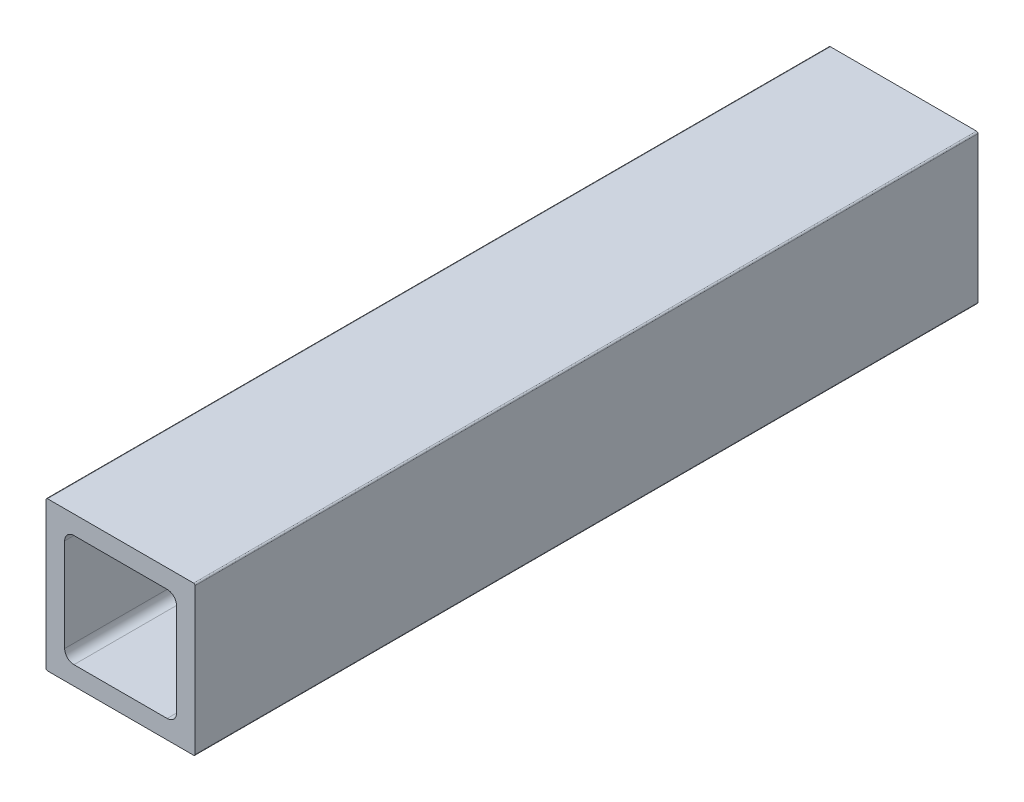
ISO-10303-21;
HEADER;
FILE_DESCRIPTION(('STEP AP214'),'2;1');
FILE_NAME('part.step','',(''),(''),'','','');
FILE_SCHEMA(('AUTOMOTIVE_DESIGN { 1 0 10303 214 1 1 1 1 }'));
ENDSEC;
DATA;
#1=APPLICATION_CONTEXT('core data for automotive mechanical design processes');
#2=APPLICATION_PROTOCOL_DEFINITION('international standard','automotive_design',2000,#1);
#3=PRODUCT_CONTEXT('',#1,'mechanical');
#4=PRODUCT('Part','Part','',(#3));
#5=PRODUCT_RELATED_PRODUCT_CATEGORY('part','',(#4));
#6=PRODUCT_DEFINITION_FORMATION('','',#4);
#7=PRODUCT_DEFINITION_CONTEXT('part definition',#1,'design');
#8=PRODUCT_DEFINITION('design','',#6,#7);
#9=PRODUCT_DEFINITION_SHAPE('','',#8);
#10=(LENGTH_UNIT() NAMED_UNIT(*) SI_UNIT(.MILLI.,.METRE.));
#11=(NAMED_UNIT(*) PLANE_ANGLE_UNIT() SI_UNIT($,.RADIAN.));
#12=(NAMED_UNIT(*) SI_UNIT($,.STERADIAN.) SOLID_ANGLE_UNIT());
#13=UNCERTAINTY_MEASURE_WITH_UNIT(LENGTH_MEASURE(1.E-05),#10,'distance_accuracy_value','');
#14=(GEOMETRIC_REPRESENTATION_CONTEXT(3) GLOBAL_UNCERTAINTY_ASSIGNED_CONTEXT((#13)) GLOBAL_UNIT_ASSIGNED_CONTEXT((#10,
#11,#12)) REPRESENTATION_CONTEXT('',''));
#15=CARTESIAN_POINT('',(0.,0.,0.));
#16=DIRECTION('',(0.,0.,1.));
#17=DIRECTION('',(1.,0.,0.));
#18=AXIS2_PLACEMENT_3D('',#15,#16,#17);
#19=CARTESIAN_POINT('',(0.254,0.254,0.));
#20=DIRECTION('',(0.,0.,-1.));
#21=DIRECTION('',(0.,-1.,0.));
#22=AXIS2_PLACEMENT_3D('',#19,#20,#21);
#23=PLANE('',#22);
#24=CARTESIAN_POINT('',(0.254,0.254,0.));
#25=DIRECTION('',(0.,0.,1.));
#26=DIRECTION('',(-1.,0.,0.));
#27=AXIS2_PLACEMENT_3D('',#24,#25,#26);
#28=CIRCLE('',#27,0.254);
#29=CARTESIAN_POINT('',(0.,0.254,0.));
#30=VERTEX_POINT('',#29);
#31=CARTESIAN_POINT('',(0.254,0.,0.));
#32=VERTEX_POINT('',#31);
#33=EDGE_CURVE('E193',#30,#32,#28,.T.);
#34=ORIENTED_EDGE('',*,*,#33,.F.);
#35=DIRECTION('',(0.,-1.,0.));
#36=VECTOR('',#35,1.);
#37=CARTESIAN_POINT('',(0.,0.254,0.));
#38=LINE('',#37,#36);
#39=CARTESIAN_POINT('',(0.,25.146,0.));
#40=VERTEX_POINT('',#39);
#41=EDGE_CURVE('E191',#40,#30,#38,.T.);
#42=ORIENTED_EDGE('',*,*,#41,.F.);
#43=CARTESIAN_POINT('',(0.254,25.146,0.));
#44=DIRECTION('',(0.,0.,1.));
#45=DIRECTION('',(-1.,0.,0.));
#46=AXIS2_PLACEMENT_3D('',#43,#44,#45);
#47=CIRCLE('',#46,0.254);
#48=CARTESIAN_POINT('',(0.254,25.4,0.));
#49=VERTEX_POINT('',#48);
#50=EDGE_CURVE('E213',#49,#40,#47,.T.);
#51=ORIENTED_EDGE('',*,*,#50,.F.);
#52=DIRECTION('',(-1.,0.,0.));
#53=VECTOR('',#52,1.);
#54=CARTESIAN_POINT('',(0.254,25.4,0.));
#55=LINE('',#54,#53);
#56=CARTESIAN_POINT('',(25.146,25.4,0.));
#57=VERTEX_POINT('',#56);
#58=EDGE_CURVE('E204',#57,#49,#55,.T.);
#59=ORIENTED_EDGE('',*,*,#58,.F.);
#60=CARTESIAN_POINT('',(25.146,25.146,0.));
#61=DIRECTION('',(0.,0.,1.));
#62=DIRECTION('',(-1.,0.,0.));
#63=AXIS2_PLACEMENT_3D('',#60,#61,#62);
#64=CIRCLE('',#63,0.254);
#65=CARTESIAN_POINT('',(25.4,25.146,0.));
#66=VERTEX_POINT('',#65);
#67=EDGE_CURVE('E236',#66,#57,#64,.T.);
#68=ORIENTED_EDGE('',*,*,#67,.F.);
#69=DIRECTION('',(0.,1.,0.));
#70=VECTOR('',#69,1.);
#71=CARTESIAN_POINT('',(25.4,0.254,0.));
#72=LINE('',#71,#70);
#73=CARTESIAN_POINT('',(25.4,0.254,0.));
#74=VERTEX_POINT('',#73);
#75=EDGE_CURVE('E235',#74,#66,#72,.T.);
#76=ORIENTED_EDGE('',*,*,#75,.F.);
#77=CARTESIAN_POINT('',(25.146,0.254,0.));
#78=DIRECTION('',(0.,0.,1.));
#79=DIRECTION('',(1.,0.,0.));
#80=AXIS2_PLACEMENT_3D('',#77,#78,#79);
#81=CIRCLE('',#80,0.254);
#82=CARTESIAN_POINT('',(25.146,0.,0.));
#83=VERTEX_POINT('',#82);
#84=EDGE_CURVE('E206',#83,#74,#81,.T.);
#85=ORIENTED_EDGE('',*,*,#84,.F.);
#86=DIRECTION('',(1.,0.,0.));
#87=VECTOR('',#86,1.);
#88=CARTESIAN_POINT('',(0.254,0.,0.));
#89=LINE('',#88,#87);
#90=EDGE_CURVE('E194',#32,#83,#89,.T.);
#91=ORIENTED_EDGE('',*,*,#90,.F.);
#92=EDGE_LOOP('',(#34,#42,#51,#59,#68,#76,#85,#91));
#93=FACE_BOUND('',#92,.T.);
#94=DIRECTION('',(0.,-1.,0.));
#95=VECTOR('',#94,1.);
#96=CARTESIAN_POINT('',(3.175,4.7625,0.));
#97=LINE('',#96,#95);
#98=CARTESIAN_POINT('',(3.175,20.6375,0.));
#99=VERTEX_POINT('',#98);
#100=CARTESIAN_POINT('',(3.175,4.7625,0.));
#101=VERTEX_POINT('',#100);
#102=EDGE_CURVE('E52',#99,#101,#97,.T.);
#103=ORIENTED_EDGE('',*,*,#102,.T.);
#104=CARTESIAN_POINT('',(4.7625,4.7625,0.));
#105=DIRECTION('',(0.,0.,1.));
#106=DIRECTION('',(1.,0.,0.));
#107=AXIS2_PLACEMENT_3D('',#104,#105,#106);
#108=CIRCLE('',#107,1.5875);
#109=CARTESIAN_POINT('',(4.7625,3.175,0.));
#110=VERTEX_POINT('',#109);
#111=EDGE_CURVE('E266',#101,#110,#108,.T.);
#112=ORIENTED_EDGE('',*,*,#111,.T.);
#113=DIRECTION('',(1.,0.,0.));
#114=VECTOR('',#113,1.);
#115=CARTESIAN_POINT('',(4.7625,3.175,0.));
#116=LINE('',#115,#114);
#117=CARTESIAN_POINT('',(20.6375,3.175,0.));
#118=VERTEX_POINT('',#117);
#119=EDGE_CURVE('E250',#110,#118,#116,.T.);
#120=ORIENTED_EDGE('',*,*,#119,.T.);
#121=CARTESIAN_POINT('',(20.6375,4.7625,0.));
#122=DIRECTION('',(0.,0.,1.));
#123=DIRECTION('',(-1.,0.,0.));
#124=AXIS2_PLACEMENT_3D('',#121,#122,#123);
#125=CIRCLE('',#124,1.5875);
#126=CARTESIAN_POINT('',(22.225,4.7625,0.));
#127=VERTEX_POINT('',#126);
#128=EDGE_CURVE('E223',#118,#127,#125,.T.);
#129=ORIENTED_EDGE('',*,*,#128,.T.);
#130=DIRECTION('',(0.,1.,0.));
#131=VECTOR('',#130,1.);
#132=CARTESIAN_POINT('',(22.225,4.7625,0.));
#133=LINE('',#132,#131);
#134=CARTESIAN_POINT('',(22.225,20.6375,0.));
#135=VERTEX_POINT('',#134);
#136=EDGE_CURVE('E219',#127,#135,#133,.T.);
#137=ORIENTED_EDGE('',*,*,#136,.T.);
#138=CARTESIAN_POINT('',(20.6375,20.6375,0.));
#139=DIRECTION('',(0.,0.,1.));
#140=DIRECTION('',(-1.,0.,0.));
#141=AXIS2_PLACEMENT_3D('',#138,#139,#140);
#142=CIRCLE('',#141,1.5875);
#143=CARTESIAN_POINT('',(20.6375,22.225,0.));
#144=VERTEX_POINT('',#143);
#145=EDGE_CURVE('E224',#135,#144,#142,.T.);
#146=ORIENTED_EDGE('',*,*,#145,.T.);
#147=DIRECTION('',(-1.,0.,0.));
#148=VECTOR('',#147,1.);
#149=CARTESIAN_POINT('',(4.7625,22.225,0.));
#150=LINE('',#149,#148);
#151=CARTESIAN_POINT('',(4.7625,22.225,0.));
#152=VERTEX_POINT('',#151);
#153=EDGE_CURVE('E229',#144,#152,#150,.T.);
#154=ORIENTED_EDGE('',*,*,#153,.T.);
#155=CARTESIAN_POINT('',(4.7625,20.6375,0.));
#156=DIRECTION('',(0.,0.,1.));
#157=DIRECTION('',(-1.,0.,0.));
#158=AXIS2_PLACEMENT_3D('',#155,#156,#157);
#159=CIRCLE('',#158,1.5875);
#160=EDGE_CURVE('E197',#152,#99,#159,.T.);
#161=ORIENTED_EDGE('',*,*,#160,.T.);
#162=EDGE_LOOP('',(#103,#112,#120,#129,#137,#146,#154,#161));
#163=FACE_BOUND('',#162,.T.);
#164=ADVANCED_FACE('F44',(#93,#163),#23,.T.);
#165=CARTESIAN_POINT('',(0.254,0.254,1828.8));
#166=DIRECTION('',(0.,0.,-1.));
#167=DIRECTION('',(-1.,0.,0.));
#168=AXIS2_PLACEMENT_3D('',#165,#166,#167);
#169=CYLINDRICAL_SURFACE('',#168,0.254);
#170=CARTESIAN_POINT('',(0.254,0.254,133.35));
#171=DIRECTION('',(0.,0.,-1.));
#172=DIRECTION('',(-1.,0.,0.));
#173=AXIS2_PLACEMENT_3D('',#170,#171,#172);
#174=CIRCLE('',#173,0.254);
#175=CARTESIAN_POINT('',(0.,0.254,133.35));
#176=VERTEX_POINT('',#175);
#177=CARTESIAN_POINT('',(0.254,0.,133.35));
#178=VERTEX_POINT('',#177);
#179=EDGE_CURVE('E172',#176,#178,#174,.F.);
#180=ORIENTED_EDGE('',*,*,#179,.F.);
#181=DIRECTION('',(0.,0.,-1.));
#182=VECTOR('',#181,1.);
#183=CARTESIAN_POINT('',(0.,0.254,1828.8));
#184=LINE('',#183,#182);
#185=EDGE_CURVE('E183',#176,#30,#184,.T.);
#186=ORIENTED_EDGE('',*,*,#185,.T.);
#187=ORIENTED_EDGE('',*,*,#33,.T.);
#188=DIRECTION('',(0.,0.,-1.));
#189=VECTOR('',#188,1.);
#190=CARTESIAN_POINT('',(0.254,0.,1828.8));
#191=LINE('',#190,#189);
#192=EDGE_CURVE('E185',#178,#32,#191,.T.);
#193=ORIENTED_EDGE('',*,*,#192,.F.);
#194=EDGE_LOOP('',(#180,#186,#187,#193));
#195=FACE_BOUND('',#194,.T.);
#196=ADVANCED_FACE('F181',(#195),#169,.T.);
#197=CARTESIAN_POINT('',(0.254,0.,1828.8));
#198=DIRECTION('',(0.,1.,0.));
#199=DIRECTION('',(1.,0.,0.));
#200=AXIS2_PLACEMENT_3D('',#197,#198,#199);
#201=PLANE('',#200);
#202=DIRECTION('',(0.,0.,-1.));
#203=VECTOR('',#202,1.);
#204=CARTESIAN_POINT('',(25.146,0.,1828.8));
#205=LINE('',#204,#203);
#206=CARTESIAN_POINT('',(25.146,0.,133.35));
#207=VERTEX_POINT('',#206);
#208=EDGE_CURVE('E210',#207,#83,#205,.T.);
#209=ORIENTED_EDGE('',*,*,#208,.F.);
#210=DIRECTION('',(1.,0.,0.));
#211=VECTOR('',#210,1.);
#212=CARTESIAN_POINT('',(0.,0.,133.35));
#213=LINE('',#212,#211);
#214=EDGE_CURVE('E177',#178,#207,#213,.T.);
#215=ORIENTED_EDGE('',*,*,#214,.F.);
#216=ORIENTED_EDGE('',*,*,#192,.T.);
#217=ORIENTED_EDGE('',*,*,#90,.T.);
#218=EDGE_LOOP('',(#209,#215,#216,#217));
#219=FACE_BOUND('',#218,.T.);
#220=ADVANCED_FACE('F289',(#219),#201,.F.);
#221=CARTESIAN_POINT('',(25.146,0.254,1828.8));
#222=DIRECTION('',(0.,0.,-1.));
#223=DIRECTION('',(-1.,0.,0.));
#224=AXIS2_PLACEMENT_3D('',#221,#222,#223);
#225=CYLINDRICAL_SURFACE('',#224,0.254);
#226=CARTESIAN_POINT('',(25.146,0.254,133.35));
#227=DIRECTION('',(0.,0.,-1.));
#228=DIRECTION('',(-1.,0.,0.));
#229=AXIS2_PLACEMENT_3D('',#226,#227,#228);
#230=CIRCLE('',#229,0.254);
#231=CARTESIAN_POINT('',(25.4,0.254,133.35));
#232=VERTEX_POINT('',#231);
#233=EDGE_CURVE('E187',#207,#232,#230,.F.);
#234=ORIENTED_EDGE('',*,*,#233,.F.);
#235=ORIENTED_EDGE('',*,*,#208,.T.);
#236=ORIENTED_EDGE('',*,*,#84,.T.);
#237=DIRECTION('',(0.,0.,-1.));
#238=VECTOR('',#237,1.);
#239=CARTESIAN_POINT('',(25.4,0.254,1828.8));
#240=LINE('',#239,#238);
#241=EDGE_CURVE('E233',#232,#74,#240,.T.);
#242=ORIENTED_EDGE('',*,*,#241,.F.);
#243=EDGE_LOOP('',(#234,#235,#236,#242));
#244=FACE_BOUND('',#243,.T.);
#245=ADVANCED_FACE('F283',(#244),#225,.T.);
#246=CARTESIAN_POINT('',(25.4,0.254,1828.8));
#247=DIRECTION('',(-1.,0.,0.));
#248=DIRECTION('',(0.,0.,1.));
#249=AXIS2_PLACEMENT_3D('',#246,#247,#248);
#250=PLANE('',#249);
#251=DIRECTION('',(0.,0.,-1.));
#252=VECTOR('',#251,1.);
#253=CARTESIAN_POINT('',(25.4,25.146,1828.8));
#254=LINE('',#253,#252);
#255=CARTESIAN_POINT('',(25.4,25.146,133.35));
#256=VERTEX_POINT('',#255);
#257=EDGE_CURVE('E258',#256,#66,#254,.T.);
#258=ORIENTED_EDGE('',*,*,#257,.F.);
#259=DIRECTION('',(0.,1.,0.));
#260=VECTOR('',#259,1.);
#261=CARTESIAN_POINT('',(25.4,0.,133.35));
#262=LINE('',#261,#260);
#263=EDGE_CURVE('E498',#232,#256,#262,.T.);
#264=ORIENTED_EDGE('',*,*,#263,.F.);
#265=ORIENTED_EDGE('',*,*,#241,.T.);
#266=ORIENTED_EDGE('',*,*,#75,.T.);
#267=EDGE_LOOP('',(#258,#264,#265,#266));
#268=FACE_BOUND('',#267,.T.);
#269=ADVANCED_FACE('F288',(#268),#250,.F.);
#270=CARTESIAN_POINT('',(25.146,25.146,1828.8));
#271=DIRECTION('',(0.,0.,-1.));
#272=DIRECTION('',(-1.,0.,0.));
#273=AXIS2_PLACEMENT_3D('',#270,#271,#272);
#274=CYLINDRICAL_SURFACE('',#273,0.254);
#275=CARTESIAN_POINT('',(25.146,25.146,133.35));
#276=DIRECTION('',(0.,0.,-1.));
#277=DIRECTION('',(-1.,0.,0.));
#278=AXIS2_PLACEMENT_3D('',#275,#276,#277);
#279=CIRCLE('',#278,0.254);
#280=CARTESIAN_POINT('',(25.146,25.4,133.35));
#281=VERTEX_POINT('',#280);
#282=EDGE_CURVE('E492',#256,#281,#279,.F.);
#283=ORIENTED_EDGE('',*,*,#282,.F.);
#284=ORIENTED_EDGE('',*,*,#257,.T.);
#285=ORIENTED_EDGE('',*,*,#67,.T.);
#286=DIRECTION('',(0.,0.,-1.));
#287=VECTOR('',#286,1.);
#288=CARTESIAN_POINT('',(25.146,25.4,1828.8));
#289=LINE('',#288,#287);
#290=EDGE_CURVE('E227',#281,#57,#289,.T.);
#291=ORIENTED_EDGE('',*,*,#290,.F.);
#292=EDGE_LOOP('',(#283,#284,#285,#291));
#293=FACE_BOUND('',#292,.T.);
#294=ADVANCED_FACE('F46',(#293),#274,.T.);
#295=CARTESIAN_POINT('',(0.254,25.4,1828.8));
#296=DIRECTION('',(0.,-1.,0.));
#297=DIRECTION('',(0.,0.,-1.));
#298=AXIS2_PLACEMENT_3D('',#295,#296,#297);
#299=PLANE('',#298);
#300=DIRECTION('',(0.,0.,-1.));
#301=VECTOR('',#300,1.);
#302=CARTESIAN_POINT('',(0.254,25.4,1828.8));
#303=LINE('',#302,#301);
#304=CARTESIAN_POINT('',(0.254,25.4,133.35));
#305=VERTEX_POINT('',#304);
#306=EDGE_CURVE('E211',#305,#49,#303,.T.);
#307=ORIENTED_EDGE('',*,*,#306,.F.);
#308=DIRECTION('',(-1.,0.,0.));
#309=VECTOR('',#308,1.);
#310=CARTESIAN_POINT('',(0.,25.4,133.35));
#311=LINE('',#310,#309);
#312=EDGE_CURVE('E545',#281,#305,#311,.T.);
#313=ORIENTED_EDGE('',*,*,#312,.F.);
#314=ORIENTED_EDGE('',*,*,#290,.T.);
#315=ORIENTED_EDGE('',*,*,#58,.T.);
#316=EDGE_LOOP('',(#307,#313,#314,#315));
#317=FACE_BOUND('',#316,.T.);
#318=ADVANCED_FACE('F347',(#317),#299,.F.);
#319=CARTESIAN_POINT('',(0.254,25.146,1828.8));
#320=DIRECTION('',(0.,0.,-1.));
#321=DIRECTION('',(-1.,0.,0.));
#322=AXIS2_PLACEMENT_3D('',#319,#320,#321);
#323=CYLINDRICAL_SURFACE('',#322,0.254);
#324=CARTESIAN_POINT('',(0.254,25.146,133.35));
#325=DIRECTION('',(0.,0.,-1.));
#326=DIRECTION('',(-1.,0.,0.));
#327=AXIS2_PLACEMENT_3D('',#324,#325,#326);
#328=CIRCLE('',#327,0.254);
#329=CARTESIAN_POINT('',(0.,25.146,133.35));
#330=VERTEX_POINT('',#329);
#331=EDGE_CURVE('E59',#305,#330,#328,.F.);
#332=ORIENTED_EDGE('',*,*,#331,.F.);
#333=ORIENTED_EDGE('',*,*,#306,.T.);
#334=ORIENTED_EDGE('',*,*,#50,.T.);
#335=DIRECTION('',(0.,0.,-1.));
#336=VECTOR('',#335,1.);
#337=CARTESIAN_POINT('',(0.,25.146,1828.8));
#338=LINE('',#337,#336);
#339=EDGE_CURVE('E216',#330,#40,#338,.T.);
#340=ORIENTED_EDGE('',*,*,#339,.F.);
#341=EDGE_LOOP('',(#332,#333,#334,#340));
#342=FACE_BOUND('',#341,.T.);
#343=ADVANCED_FACE('F276',(#342),#323,.T.);
#344=CARTESIAN_POINT('',(0.,0.254,1828.8));
#345=DIRECTION('',(1.,0.,0.));
#346=DIRECTION('',(0.,1.,0.));
#347=AXIS2_PLACEMENT_3D('',#344,#345,#346);
#348=PLANE('',#347);
#349=ORIENTED_EDGE('',*,*,#185,.F.);
#350=DIRECTION('',(0.,-1.,0.));
#351=VECTOR('',#350,1.);
#352=CARTESIAN_POINT('',(0.,0.,133.35));
#353=LINE('',#352,#351);
#354=EDGE_CURVE('E169',#330,#176,#353,.T.);
#355=ORIENTED_EDGE('',*,*,#354,.F.);
#356=ORIENTED_EDGE('',*,*,#339,.T.);
#357=ORIENTED_EDGE('',*,*,#41,.T.);
#358=EDGE_LOOP('',(#349,#355,#356,#357));
#359=FACE_BOUND('',#358,.T.);
#360=ADVANCED_FACE('F189',(#359),#348,.F.);
#361=CARTESIAN_POINT('',(4.7625,4.7625,1828.8));
#362=DIRECTION('',(0.,0.,-1.));
#363=DIRECTION('',(-1.,0.,0.));
#364=AXIS2_PLACEMENT_3D('',#361,#362,#363);
#365=CYLINDRICAL_SURFACE('',#364,1.5875);
#366=DIRECTION('',(0.,0.,-1.));
#367=VECTOR('',#366,1.);
#368=CARTESIAN_POINT('',(3.175,4.7625,1828.8));
#369=LINE('',#368,#367);
#370=CARTESIAN_POINT('',(3.175,4.7625,133.35));
#371=VERTEX_POINT('',#370);
#372=EDGE_CURVE('E186',#371,#101,#369,.T.);
#373=ORIENTED_EDGE('',*,*,#372,.F.);
#374=CARTESIAN_POINT('',(4.7625,4.7625,133.35));
#375=DIRECTION('',(0.,0.,-1.));
#376=DIRECTION('',(-1.,0.,0.));
#377=AXIS2_PLACEMENT_3D('',#374,#375,#376);
#378=CIRCLE('',#377,1.5875);
#379=CARTESIAN_POINT('',(4.7625,3.175,133.35));
#380=VERTEX_POINT('',#379);
#381=EDGE_CURVE('E66',#371,#380,#378,.F.);
#382=ORIENTED_EDGE('',*,*,#381,.T.);
#383=DIRECTION('',(0.,0.,-1.));
#384=VECTOR('',#383,1.);
#385=CARTESIAN_POINT('',(4.7625,3.175,1828.8));
#386=LINE('',#385,#384);
#387=EDGE_CURVE('E214',#380,#110,#386,.T.);
#388=ORIENTED_EDGE('',*,*,#387,.T.);
#389=ORIENTED_EDGE('',*,*,#111,.F.);
#390=EDGE_LOOP('',(#373,#382,#388,#389));
#391=FACE_BOUND('',#390,.T.);
#392=ADVANCED_FACE('F275',(#391),#365,.F.);
#393=CARTESIAN_POINT('',(4.7625,3.175,1828.8));
#394=DIRECTION('',(0.,1.,0.));
#395=DIRECTION('',(1.,0.,0.));
#396=AXIS2_PLACEMENT_3D('',#393,#394,#395);
#397=PLANE('',#396);
#398=DIRECTION('',(-1.,0.,0.));
#399=VECTOR('',#398,1.);
#400=CARTESIAN_POINT('',(4.7625,3.175,133.35));
#401=LINE('',#400,#399);
#402=CARTESIAN_POINT('',(20.6375,3.175,133.35));
#403=VERTEX_POINT('',#402);
#404=EDGE_CURVE('E532',#403,#380,#401,.T.);
#405=ORIENTED_EDGE('',*,*,#404,.F.);
#406=DIRECTION('',(0.,0.,-1.));
#407=VECTOR('',#406,1.);
#408=CARTESIAN_POINT('',(20.6375,3.175,1828.8));
#409=LINE('',#408,#407);
#410=EDGE_CURVE('E217',#403,#118,#409,.T.);
#411=ORIENTED_EDGE('',*,*,#410,.T.);
#412=ORIENTED_EDGE('',*,*,#119,.F.);
#413=ORIENTED_EDGE('',*,*,#387,.F.);
#414=EDGE_LOOP('',(#405,#411,#412,#413));
#415=FACE_BOUND('',#414,.T.);
#416=ADVANCED_FACE('F302',(#415),#397,.T.);
#417=CARTESIAN_POINT('',(20.6375,4.7625,1828.8));
#418=DIRECTION('',(0.,0.,-1.));
#419=DIRECTION('',(-1.,0.,0.));
#420=AXIS2_PLACEMENT_3D('',#417,#418,#419);
#421=CYLINDRICAL_SURFACE('',#420,1.5875);
#422=ORIENTED_EDGE('',*,*,#410,.F.);
#423=CARTESIAN_POINT('',(20.6375,4.7625,133.35));
#424=DIRECTION('',(0.,0.,-1.));
#425=DIRECTION('',(-1.,0.,0.));
#426=AXIS2_PLACEMENT_3D('',#423,#424,#425);
#427=CIRCLE('',#426,1.5875);
#428=CARTESIAN_POINT('',(22.225,4.7625,133.35));
#429=VERTEX_POINT('',#428);
#430=EDGE_CURVE('E513',#403,#429,#427,.F.);
#431=ORIENTED_EDGE('',*,*,#430,.T.);
#432=DIRECTION('',(0.,0.,-1.));
#433=VECTOR('',#432,1.);
#434=CARTESIAN_POINT('',(22.225,4.7625,1828.8));
#435=LINE('',#434,#433);
#436=EDGE_CURVE('E254',#429,#127,#435,.T.);
#437=ORIENTED_EDGE('',*,*,#436,.T.);
#438=ORIENTED_EDGE('',*,*,#128,.F.);
#439=EDGE_LOOP('',(#422,#431,#437,#438));
#440=FACE_BOUND('',#439,.T.);
#441=ADVANCED_FACE('F297',(#440),#421,.F.);
#442=CARTESIAN_POINT('',(22.225,4.7625,1828.8));
#443=DIRECTION('',(-1.,0.,0.));
#444=DIRECTION('',(0.,0.,1.));
#445=AXIS2_PLACEMENT_3D('',#442,#443,#444);
#446=PLANE('',#445);
#447=DIRECTION('',(0.,-1.,0.));
#448=VECTOR('',#447,1.);
#449=CARTESIAN_POINT('',(22.225,4.7625,133.35));
#450=LINE('',#449,#448);
#451=CARTESIAN_POINT('',(22.225,20.6375,133.35));
#452=VERTEX_POINT('',#451);
#453=EDGE_CURVE('E535',#452,#429,#450,.T.);
#454=ORIENTED_EDGE('',*,*,#453,.F.);
#455=DIRECTION('',(0.,0.,-1.));
#456=VECTOR('',#455,1.);
#457=CARTESIAN_POINT('',(22.225,20.6375,1828.8));
#458=LINE('',#457,#456);
#459=EDGE_CURVE('E240',#452,#135,#458,.T.);
#460=ORIENTED_EDGE('',*,*,#459,.T.);
#461=ORIENTED_EDGE('',*,*,#136,.F.);
#462=ORIENTED_EDGE('',*,*,#436,.F.);
#463=EDGE_LOOP('',(#454,#460,#461,#462));
#464=FACE_BOUND('',#463,.T.);
#465=ADVANCED_FACE('F301',(#464),#446,.T.);
#466=CARTESIAN_POINT('',(20.6375,20.6375,1828.8));
#467=DIRECTION('',(0.,0.,-1.));
#468=DIRECTION('',(-1.,0.,0.));
#469=AXIS2_PLACEMENT_3D('',#466,#467,#468);
#470=CYLINDRICAL_SURFACE('',#469,1.5875);
#471=ORIENTED_EDGE('',*,*,#459,.F.);
#472=CARTESIAN_POINT('',(20.6375,20.6375,133.35));
#473=DIRECTION('',(0.,0.,-1.));
#474=DIRECTION('',(-1.,0.,0.));
#475=AXIS2_PLACEMENT_3D('',#472,#473,#474);
#476=CIRCLE('',#475,1.5875);
#477=CARTESIAN_POINT('',(20.6375,22.225,133.35));
#478=VERTEX_POINT('',#477);
#479=EDGE_CURVE('E537',#452,#478,#476,.F.);
#480=ORIENTED_EDGE('',*,*,#479,.T.);
#481=DIRECTION('',(0.,0.,-1.));
#482=VECTOR('',#481,1.);
#483=CARTESIAN_POINT('',(20.6375,22.225,1828.8));
#484=LINE('',#483,#482);
#485=EDGE_CURVE('E238',#478,#144,#484,.T.);
#486=ORIENTED_EDGE('',*,*,#485,.T.);
#487=ORIENTED_EDGE('',*,*,#145,.F.);
#488=EDGE_LOOP('',(#471,#480,#486,#487));
#489=FACE_BOUND('',#488,.T.);
#490=ADVANCED_FACE('F309',(#489),#470,.F.);
#491=CARTESIAN_POINT('',(4.7625,22.225,1828.8));
#492=DIRECTION('',(0.,-1.,0.));
#493=DIRECTION('',(0.,0.,-1.));
#494=AXIS2_PLACEMENT_3D('',#491,#492,#493);
#495=PLANE('',#494);
#496=DIRECTION('',(1.,0.,0.));
#497=VECTOR('',#496,1.);
#498=CARTESIAN_POINT('',(4.7625,22.225,133.35));
#499=LINE('',#498,#497);
#500=CARTESIAN_POINT('',(4.7625,22.225,133.35));
#501=VERTEX_POINT('',#500);
#502=EDGE_CURVE('E540',#501,#478,#499,.T.);
#503=ORIENTED_EDGE('',*,*,#502,.F.);
#504=DIRECTION('',(0.,0.,-1.));
#505=VECTOR('',#504,1.);
#506=CARTESIAN_POINT('',(4.7625,22.225,1828.8));
#507=LINE('',#506,#505);
#508=EDGE_CURVE('E241',#501,#152,#507,.T.);
#509=ORIENTED_EDGE('',*,*,#508,.T.);
#510=ORIENTED_EDGE('',*,*,#153,.F.);
#511=ORIENTED_EDGE('',*,*,#485,.F.);
#512=EDGE_LOOP('',(#503,#509,#510,#511));
#513=FACE_BOUND('',#512,.T.);
#514=ADVANCED_FACE('F313',(#513),#495,.T.);
#515=CARTESIAN_POINT('',(4.7625,20.6375,1828.8));
#516=DIRECTION('',(0.,0.,-1.));
#517=DIRECTION('',(-1.,0.,0.));
#518=AXIS2_PLACEMENT_3D('',#515,#516,#517);
#519=CYLINDRICAL_SURFACE('',#518,1.5875);
#520=ORIENTED_EDGE('',*,*,#508,.F.);
#521=CARTESIAN_POINT('',(4.7625,20.6375,133.35));
#522=DIRECTION('',(0.,0.,-1.));
#523=DIRECTION('',(-1.,0.,0.));
#524=AXIS2_PLACEMENT_3D('',#521,#522,#523);
#525=CIRCLE('',#524,1.5875);
#526=CARTESIAN_POINT('',(3.175,20.6375,133.35));
#527=VERTEX_POINT('',#526);
#528=EDGE_CURVE('E542',#501,#527,#525,.F.);
#529=ORIENTED_EDGE('',*,*,#528,.T.);
#530=DIRECTION('',(0.,0.,-1.));
#531=VECTOR('',#530,1.);
#532=CARTESIAN_POINT('',(3.175,20.6375,1828.8));
#533=LINE('',#532,#531);
#534=EDGE_CURVE('E245',#527,#99,#533,.T.);
#535=ORIENTED_EDGE('',*,*,#534,.T.);
#536=ORIENTED_EDGE('',*,*,#160,.F.);
#537=EDGE_LOOP('',(#520,#529,#535,#536));
#538=FACE_BOUND('',#537,.T.);
#539=ADVANCED_FACE('F390',(#538),#519,.F.);
#540=CARTESIAN_POINT('',(3.175,4.7625,1828.8));
#541=DIRECTION('',(1.,0.,0.));
#542=DIRECTION('',(0.,1.,0.));
#543=AXIS2_PLACEMENT_3D('',#540,#541,#542);
#544=PLANE('',#543);
#545=DIRECTION('',(0.,1.,0.));
#546=VECTOR('',#545,1.);
#547=CARTESIAN_POINT('',(3.175,4.7625,133.35));
#548=LINE('',#547,#546);
#549=EDGE_CURVE('E11',#371,#527,#548,.T.);
#550=ORIENTED_EDGE('',*,*,#549,.F.);
#551=ORIENTED_EDGE('',*,*,#372,.T.);
#552=ORIENTED_EDGE('',*,*,#102,.F.);
#553=ORIENTED_EDGE('',*,*,#534,.F.);
#554=EDGE_LOOP('',(#550,#551,#552,#553));
#555=FACE_BOUND('',#554,.T.);
#556=ADVANCED_FACE('F394',(#555),#544,.T.);
#557=CARTESIAN_POINT('',(0.,0.,133.35));
#558=DIRECTION('',(0.,0.,-1.));
#559=DIRECTION('',(-1.,0.,0.));
#560=AXIS2_PLACEMENT_3D('',#557,#558,#559);
#561=PLANE('',#560);
#562=ORIENTED_EDGE('',*,*,#179,.T.);
#563=ORIENTED_EDGE('',*,*,#214,.T.);
#564=ORIENTED_EDGE('',*,*,#233,.T.);
#565=ORIENTED_EDGE('',*,*,#263,.T.);
#566=ORIENTED_EDGE('',*,*,#282,.T.);
#567=ORIENTED_EDGE('',*,*,#312,.T.);
#568=ORIENTED_EDGE('',*,*,#331,.T.);
#569=ORIENTED_EDGE('',*,*,#354,.T.);
#570=EDGE_LOOP('',(#562,#563,#564,#565,#566,#567,#568,#569));
#571=FACE_BOUND('',#570,.T.);
#572=ORIENTED_EDGE('',*,*,#549,.T.);
#573=ORIENTED_EDGE('',*,*,#528,.F.);
#574=ORIENTED_EDGE('',*,*,#502,.T.);
#575=ORIENTED_EDGE('',*,*,#479,.F.);
#576=ORIENTED_EDGE('',*,*,#453,.T.);
#577=ORIENTED_EDGE('',*,*,#430,.F.);
#578=ORIENTED_EDGE('',*,*,#404,.T.);
#579=ORIENTED_EDGE('',*,*,#381,.F.);
#580=EDGE_LOOP('',(#572,#573,#574,#575,#576,#577,#578,#579));
#581=FACE_BOUND('',#580,.T.);
#582=ADVANCED_FACE('F171',(#571,#581),#561,.F.);
#583=CLOSED_SHELL('',(#164,#196,#220,#245,#269,#294,#318,#343,#360,#392,#416,#441,#465,#490,
#514,#539,#556,#582));
#584=MANIFOLD_SOLID_BREP('B2',#583);
#585=ADVANCED_BREP_SHAPE_REPRESENTATION('',(#18,#584),#14);
#586=SHAPE_DEFINITION_REPRESENTATION(#9,#585);
ENDSEC;
END-ISO-10303-21;
